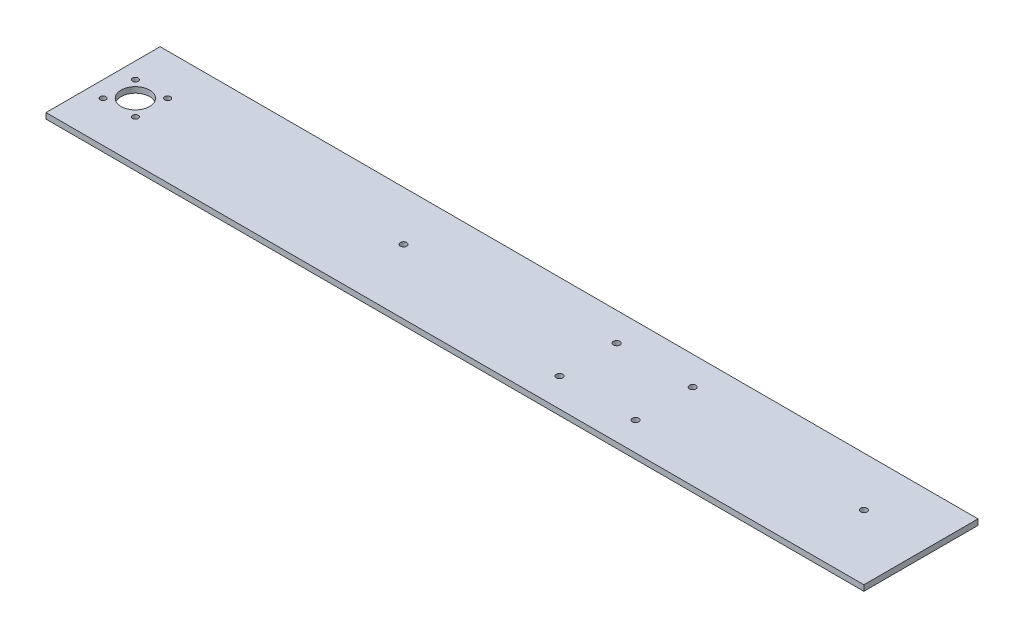
ISO-10303-21;
HEADER;
FILE_DESCRIPTION(('STEP AP214'),'2;1');
FILE_NAME('part.step','',(''),(''),'','','');
FILE_SCHEMA(('AUTOMOTIVE_DESIGN { 1 0 10303 214 1 1 1 1 }'));
ENDSEC;
DATA;
#1=APPLICATION_CONTEXT('core data for automotive mechanical design processes');
#2=APPLICATION_PROTOCOL_DEFINITION('international standard','automotive_design',2000,#1);
#3=PRODUCT_CONTEXT('',#1,'mechanical');
#4=PRODUCT('Part','Part','',(#3));
#5=PRODUCT_RELATED_PRODUCT_CATEGORY('part','',(#4));
#6=PRODUCT_DEFINITION_FORMATION('','',#4);
#7=PRODUCT_DEFINITION_CONTEXT('part definition',#1,'design');
#8=PRODUCT_DEFINITION('design','',#6,#7);
#9=PRODUCT_DEFINITION_SHAPE('','',#8);
#10=(LENGTH_UNIT() NAMED_UNIT(*) SI_UNIT(.MILLI.,.METRE.));
#11=(NAMED_UNIT(*) PLANE_ANGLE_UNIT() SI_UNIT($,.RADIAN.));
#12=(NAMED_UNIT(*) SI_UNIT($,.STERADIAN.) SOLID_ANGLE_UNIT());
#13=UNCERTAINTY_MEASURE_WITH_UNIT(LENGTH_MEASURE(1.E-05),#10,'distance_accuracy_value','');
#14=(GEOMETRIC_REPRESENTATION_CONTEXT(3) GLOBAL_UNCERTAINTY_ASSIGNED_CONTEXT((#13)) GLOBAL_UNIT_ASSIGNED_CONTEXT((#10,
#11,#12)) REPRESENTATION_CONTEXT('',''));
#15=CARTESIAN_POINT('',(0.,0.,0.));
#16=DIRECTION('',(0.,0.,1.));
#17=DIRECTION('',(1.,0.,0.));
#18=AXIS2_PLACEMENT_3D('',#15,#16,#17);
#19=CARTESIAN_POINT('',(-130.,3.,0.));
#20=DIRECTION('',(1.,0.,0.));
#21=DIRECTION('',(0.,0.,-1.));
#22=AXIS2_PLACEMENT_3D('',#19,#20,#21);
#23=PLANE('',#22);
#24=DIRECTION('',(0.,0.,1.));
#25=VECTOR('',#24,1.);
#26=CARTESIAN_POINT('',(-130.,0.,0.));
#27=LINE('',#26,#25);
#28=CARTESIAN_POINT('',(-130.,0.,-60.));
#29=VERTEX_POINT('',#28);
#30=CARTESIAN_POINT('',(-130.,0.,0.));
#31=VERTEX_POINT('',#30);
#32=EDGE_CURVE('E103',#29,#31,#27,.T.);
#33=ORIENTED_EDGE('',*,*,#32,.T.);
#34=DIRECTION('',(0.,-1.,0.));
#35=VECTOR('',#34,1.);
#36=CARTESIAN_POINT('',(-130.,3.,0.));
#37=LINE('',#36,#35);
#38=CARTESIAN_POINT('',(-130.,3.,0.));
#39=VERTEX_POINT('',#38);
#40=EDGE_CURVE('E11',#39,#31,#37,.T.);
#41=ORIENTED_EDGE('',*,*,#40,.F.);
#42=DIRECTION('',(0.,0.,1.));
#43=VECTOR('',#42,1.);
#44=CARTESIAN_POINT('',(-130.,3.,0.));
#45=LINE('',#44,#43);
#46=CARTESIAN_POINT('',(-130.,3.,-60.));
#47=VERTEX_POINT('',#46);
#48=EDGE_CURVE('E90',#47,#39,#45,.T.);
#49=ORIENTED_EDGE('',*,*,#48,.F.);
#50=DIRECTION('',(0.,-1.,0.));
#51=VECTOR('',#50,1.);
#52=CARTESIAN_POINT('',(-130.,3.,-60.));
#53=LINE('',#52,#51);
#54=EDGE_CURVE('E99',#47,#29,#53,.T.);
#55=ORIENTED_EDGE('',*,*,#54,.T.);
#56=EDGE_LOOP('',(#33,#41,#49,#55));
#57=FACE_BOUND('',#56,.T.);
#58=ADVANCED_FACE('F37',(#57),#23,.F.);
#59=CARTESIAN_POINT('',(-130.,3.,0.));
#60=DIRECTION('',(0.,0.,-1.));
#61=DIRECTION('',(-1.,0.,0.));
#62=AXIS2_PLACEMENT_3D('',#59,#60,#61);
#63=PLANE('',#62);
#64=DIRECTION('',(1.,0.,0.));
#65=VECTOR('',#64,1.);
#66=CARTESIAN_POINT('',(-130.,0.,0.));
#67=LINE('',#66,#65);
#68=CARTESIAN_POINT('',(300.,0.,0.));
#69=VERTEX_POINT('',#68);
#70=EDGE_CURVE('E94',#31,#69,#67,.T.);
#71=ORIENTED_EDGE('',*,*,#70,.T.);
#72=DIRECTION('',(0.,-1.,0.));
#73=VECTOR('',#72,1.);
#74=CARTESIAN_POINT('',(300.,3.,0.));
#75=LINE('',#74,#73);
#76=CARTESIAN_POINT('',(300.,3.,0.));
#77=VERTEX_POINT('',#76);
#78=EDGE_CURVE('E46',#77,#69,#75,.T.);
#79=ORIENTED_EDGE('',*,*,#78,.F.);
#80=DIRECTION('',(1.,0.,0.));
#81=VECTOR('',#80,1.);
#82=CARTESIAN_POINT('',(-130.,3.,0.));
#83=LINE('',#82,#81);
#84=EDGE_CURVE('E85',#39,#77,#83,.T.);
#85=ORIENTED_EDGE('',*,*,#84,.F.);
#86=ORIENTED_EDGE('',*,*,#40,.T.);
#87=EDGE_LOOP('',(#71,#79,#85,#86));
#88=FACE_BOUND('',#87,.T.);
#89=ADVANCED_FACE('F93',(#88),#63,.F.);
#90=CARTESIAN_POINT('',(300.,3.,0.));
#91=DIRECTION('',(-1.,0.,0.));
#92=DIRECTION('',(0.,0.,1.));
#93=AXIS2_PLACEMENT_3D('',#90,#91,#92);
#94=PLANE('',#93);
#95=DIRECTION('',(0.,0.,-1.));
#96=VECTOR('',#95,1.);
#97=CARTESIAN_POINT('',(300.,0.,0.));
#98=LINE('',#97,#96);
#99=CARTESIAN_POINT('',(300.,0.,-60.));
#100=VERTEX_POINT('',#99);
#101=EDGE_CURVE('E72',#69,#100,#98,.T.);
#102=ORIENTED_EDGE('',*,*,#101,.T.);
#103=DIRECTION('',(0.,-1.,0.));
#104=VECTOR('',#103,1.);
#105=CARTESIAN_POINT('',(300.,3.,-60.));
#106=LINE('',#105,#104);
#107=CARTESIAN_POINT('',(300.,3.,-60.));
#108=VERTEX_POINT('',#107);
#109=EDGE_CURVE('E95',#108,#100,#106,.T.);
#110=ORIENTED_EDGE('',*,*,#109,.F.);
#111=DIRECTION('',(0.,0.,-1.));
#112=VECTOR('',#111,1.);
#113=CARTESIAN_POINT('',(300.,3.,0.));
#114=LINE('',#113,#112);
#115=EDGE_CURVE('E88',#77,#108,#114,.T.);
#116=ORIENTED_EDGE('',*,*,#115,.F.);
#117=ORIENTED_EDGE('',*,*,#78,.T.);
#118=EDGE_LOOP('',(#102,#110,#116,#117));
#119=FACE_BOUND('',#118,.T.);
#120=ADVANCED_FACE('F97',(#119),#94,.F.);
#121=CARTESIAN_POINT('',(-130.,3.,-60.));
#122=DIRECTION('',(0.,0.,1.));
#123=DIRECTION('',(1.,0.,0.));
#124=AXIS2_PLACEMENT_3D('',#121,#122,#123);
#125=PLANE('',#124);
#126=DIRECTION('',(-1.,0.,0.));
#127=VECTOR('',#126,1.);
#128=CARTESIAN_POINT('',(-130.,0.,-60.));
#129=LINE('',#128,#127);
#130=EDGE_CURVE('E78',#100,#29,#129,.T.);
#131=ORIENTED_EDGE('',*,*,#130,.T.);
#132=ORIENTED_EDGE('',*,*,#54,.F.);
#133=DIRECTION('',(-1.,0.,0.));
#134=VECTOR('',#133,1.);
#135=CARTESIAN_POINT('',(-130.,3.,-60.));
#136=LINE('',#135,#134);
#137=EDGE_CURVE('E55',#108,#47,#136,.T.);
#138=ORIENTED_EDGE('',*,*,#137,.F.);
#139=ORIENTED_EDGE('',*,*,#109,.T.);
#140=EDGE_LOOP('',(#131,#132,#138,#139));
#141=FACE_BOUND('',#140,.T.);
#142=ADVANCED_FACE('F189',(#141),#125,.F.);
#143=CARTESIAN_POINT('',(0.,3.,0.));
#144=DIRECTION('',(0.,-1.,0.));
#145=DIRECTION('',(0.,0.,-1.));
#146=AXIS2_PLACEMENT_3D('',#143,#144,#145);
#147=PLANE('',#146);
#148=CARTESIAN_POINT('',(-104.514718625754,3.,-21.5147186257579));
#149=DIRECTION('',(0.,1.,0.));
#150=DIRECTION('',(0.,0.,1.));
#151=AXIS2_PLACEMENT_3D('',#148,#149,#150);
#152=CIRCLE('',#151,1.49999999999999);
#153=CARTESIAN_POINT('',(-104.514718625754,3.,-20.0147186257579));
#154=VERTEX_POINT('',#153);
#155=EDGE_CURVE('E133',#154,#154,#152,.T.);
#156=ORIENTED_EDGE('',*,*,#155,.F.);
#157=EDGE_LOOP('',(#156));
#158=FACE_BOUND('',#157,.T.);
#159=CARTESIAN_POINT('',(-104.514718625754,3.,-38.485281374235));
#160=DIRECTION('',(0.,1.,0.));
#161=DIRECTION('',(0.,0.,1.));
#162=AXIS2_PLACEMENT_3D('',#159,#160,#161);
#163=CIRCLE('',#162,1.49999999999999);
#164=CARTESIAN_POINT('',(-104.514718625754,3.,-36.985281374235));
#165=VERTEX_POINT('',#164);
#166=EDGE_CURVE('E123',#165,#165,#163,.T.);
#167=ORIENTED_EDGE('',*,*,#166,.F.);
#168=EDGE_LOOP('',(#167));
#169=FACE_BOUND('',#168,.T.);
#170=CARTESIAN_POINT('',(-121.485281374231,3.,-21.5147186257577));
#171=DIRECTION('',(0.,1.,0.));
#172=DIRECTION('',(0.,0.,1.));
#173=AXIS2_PLACEMENT_3D('',#170,#171,#172);
#174=CIRCLE('',#173,1.49999999999999);
#175=CARTESIAN_POINT('',(-121.485281374231,3.,-20.0147186257577));
#176=VERTEX_POINT('',#175);
#177=EDGE_CURVE('E120',#176,#176,#174,.T.);
#178=ORIENTED_EDGE('',*,*,#177,.F.);
#179=EDGE_LOOP('',(#178));
#180=FACE_BOUND('',#179,.T.);
#181=CARTESIAN_POINT('',(-121.485281374231,3.,-38.4852813742348));
#182=DIRECTION('',(0.,1.,0.));
#183=DIRECTION('',(0.,0.,1.));
#184=AXIS2_PLACEMENT_3D('',#181,#182,#183);
#185=CIRCLE('',#184,1.49999999999999);
#186=CARTESIAN_POINT('',(-121.485281374231,3.,-36.9852813742348));
#187=VERTEX_POINT('',#186);
#188=EDGE_CURVE('E119',#187,#187,#185,.T.);
#189=ORIENTED_EDGE('',*,*,#188,.F.);
#190=EDGE_LOOP('',(#189));
#191=FACE_BOUND('',#190,.T.);
#192=CARTESIAN_POINT('',(-113.,3.,-30.));
#193=DIRECTION('',(0.,1.,0.));
#194=DIRECTION('',(0.,0.,1.));
#195=AXIS2_PLACEMENT_3D('',#192,#193,#194);
#196=CIRCLE('',#195,7.50000000000001);
#197=CARTESIAN_POINT('',(-113.,3.,-22.5));
#198=VERTEX_POINT('',#197);
#199=EDGE_CURVE('E116',#198,#198,#196,.T.);
#200=ORIENTED_EDGE('',*,*,#199,.F.);
#201=EDGE_LOOP('',(#200));
#202=FACE_BOUND('',#201,.T.);
#203=CARTESIAN_POINT('',(266.,3.,-34.));
#204=DIRECTION('',(0.,1.,0.));
#205=DIRECTION('',(0.,0.,1.));
#206=AXIS2_PLACEMENT_3D('',#203,#204,#205);
#207=CIRCLE('',#206,1.69999999999998);
#208=CARTESIAN_POINT('',(266.,3.,-32.3));
#209=VERTEX_POINT('',#208);
#210=EDGE_CURVE('E115',#209,#209,#207,.T.);
#211=ORIENTED_EDGE('',*,*,#210,.F.);
#212=EDGE_LOOP('',(#211));
#213=FACE_BOUND('',#212,.T.);
#214=CARTESIAN_POINT('',(24.,3.,-34.));
#215=DIRECTION('',(0.,1.,0.));
#216=DIRECTION('',(0.,0.,1.));
#217=AXIS2_PLACEMENT_3D('',#214,#215,#216);
#218=CIRCLE('',#217,1.69999999999999);
#219=CARTESIAN_POINT('',(24.,3.,-32.3));
#220=VERTEX_POINT('',#219);
#221=EDGE_CURVE('E148',#220,#220,#218,.T.);
#222=ORIENTED_EDGE('',*,*,#221,.F.);
#223=EDGE_LOOP('',(#222));
#224=FACE_BOUND('',#223,.T.);
#225=CARTESIAN_POINT('',(125.,3.,-15.));
#226=DIRECTION('',(0.,1.,0.));
#227=DIRECTION('',(0.,0.,1.));
#228=AXIS2_PLACEMENT_3D('',#225,#226,#227);
#229=CIRCLE('',#228,1.69999999999998);
#230=CARTESIAN_POINT('',(125.,3.,-13.3));
#231=VERTEX_POINT('',#230);
#232=EDGE_CURVE('E154',#231,#231,#229,.T.);
#233=ORIENTED_EDGE('',*,*,#232,.F.);
#234=EDGE_LOOP('',(#233));
#235=FACE_BOUND('',#234,.T.);
#236=CARTESIAN_POINT('',(165.,3.,-15.));
#237=DIRECTION('',(0.,1.,0.));
#238=DIRECTION('',(0.,0.,1.));
#239=AXIS2_PLACEMENT_3D('',#236,#237,#238);
#240=CIRCLE('',#239,1.69999999999998);
#241=CARTESIAN_POINT('',(165.,3.,-13.3));
#242=VERTEX_POINT('',#241);
#243=EDGE_CURVE('E160',#242,#242,#240,.T.);
#244=ORIENTED_EDGE('',*,*,#243,.F.);
#245=EDGE_LOOP('',(#244));
#246=FACE_BOUND('',#245,.T.);
#247=CARTESIAN_POINT('',(165.,3.,-45.));
#248=DIRECTION('',(0.,1.,0.));
#249=DIRECTION('',(0.,0.,1.));
#250=AXIS2_PLACEMENT_3D('',#247,#248,#249);
#251=CIRCLE('',#250,1.69999999999998);
#252=CARTESIAN_POINT('',(165.,3.,-43.3));
#253=VERTEX_POINT('',#252);
#254=EDGE_CURVE('E166',#253,#253,#251,.T.);
#255=ORIENTED_EDGE('',*,*,#254,.F.);
#256=EDGE_LOOP('',(#255));
#257=FACE_BOUND('',#256,.T.);
#258=CARTESIAN_POINT('',(125.,3.,-45.));
#259=DIRECTION('',(0.,1.,0.));
#260=DIRECTION('',(0.,0.,1.));
#261=AXIS2_PLACEMENT_3D('',#258,#259,#260);
#262=CIRCLE('',#261,1.69999999999998);
#263=CARTESIAN_POINT('',(125.,3.,-43.3));
#264=VERTEX_POINT('',#263);
#265=EDGE_CURVE('E172',#264,#264,#262,.T.);
#266=ORIENTED_EDGE('',*,*,#265,.F.);
#267=EDGE_LOOP('',(#266));
#268=FACE_BOUND('',#267,.T.);
#269=ORIENTED_EDGE('',*,*,#48,.T.);
#270=ORIENTED_EDGE('',*,*,#84,.T.);
#271=ORIENTED_EDGE('',*,*,#115,.T.);
#272=ORIENTED_EDGE('',*,*,#137,.T.);
#273=EDGE_LOOP('',(#269,#270,#271,#272));
#274=FACE_BOUND('',#273,.T.);
#275=ADVANCED_FACE('F86',(#158,#169,#180,#191,#202,#213,#224,#235,#246,#257,#268,#274),#147,.F.);
#276=CARTESIAN_POINT('',(0.,0.,0.));
#277=DIRECTION('',(0.,-1.,0.));
#278=DIRECTION('',(0.,0.,-1.));
#279=AXIS2_PLACEMENT_3D('',#276,#277,#278);
#280=PLANE('',#279);
#281=CARTESIAN_POINT('',(-104.514718625754,0.,-21.5147186257579));
#282=DIRECTION('',(0.,-1.,0.));
#283=DIRECTION('',(0.,0.,-1.));
#284=AXIS2_PLACEMENT_3D('',#281,#282,#283);
#285=CIRCLE('',#284,1.49999999999999);
#286=CARTESIAN_POINT('',(-104.514718625754,0.,-23.0147186257579));
#287=VERTEX_POINT('',#286);
#288=EDGE_CURVE('E40',#287,#287,#285,.T.);
#289=ORIENTED_EDGE('',*,*,#288,.F.);
#290=EDGE_LOOP('',(#289));
#291=FACE_BOUND('',#290,.T.);
#292=CARTESIAN_POINT('',(-104.514718625754,0.,-38.485281374235));
#293=DIRECTION('',(0.,-1.,0.));
#294=DIRECTION('',(0.,0.,-1.));
#295=AXIS2_PLACEMENT_3D('',#292,#293,#294);
#296=CIRCLE('',#295,1.49999999999999);
#297=CARTESIAN_POINT('',(-104.514718625754,0.,-39.985281374235));
#298=VERTEX_POINT('',#297);
#299=EDGE_CURVE('E121',#298,#298,#296,.T.);
#300=ORIENTED_EDGE('',*,*,#299,.F.);
#301=EDGE_LOOP('',(#300));
#302=FACE_BOUND('',#301,.T.);
#303=CARTESIAN_POINT('',(-121.485281374231,0.,-21.5147186257577));
#304=DIRECTION('',(0.,-1.,0.));
#305=DIRECTION('',(0.,0.,-1.));
#306=AXIS2_PLACEMENT_3D('',#303,#304,#305);
#307=CIRCLE('',#306,1.49999999999999);
#308=CARTESIAN_POINT('',(-121.485281374231,0.,-23.0147186257577));
#309=VERTEX_POINT('',#308);
#310=EDGE_CURVE('E117',#309,#309,#307,.T.);
#311=ORIENTED_EDGE('',*,*,#310,.F.);
#312=EDGE_LOOP('',(#311));
#313=FACE_BOUND('',#312,.T.);
#314=CARTESIAN_POINT('',(-121.485281374231,0.,-38.4852813742348));
#315=DIRECTION('',(0.,-1.,0.));
#316=DIRECTION('',(0.,0.,-1.));
#317=AXIS2_PLACEMENT_3D('',#314,#315,#316);
#318=CIRCLE('',#317,1.49999999999999);
#319=CARTESIAN_POINT('',(-121.485281374231,0.,-39.9852813742348));
#320=VERTEX_POINT('',#319);
#321=EDGE_CURVE('E138',#320,#320,#318,.T.);
#322=ORIENTED_EDGE('',*,*,#321,.F.);
#323=EDGE_LOOP('',(#322));
#324=FACE_BOUND('',#323,.T.);
#325=CARTESIAN_POINT('',(-113.,0.,-30.));
#326=DIRECTION('',(0.,-1.,0.));
#327=DIRECTION('',(0.,0.,-1.));
#328=AXIS2_PLACEMENT_3D('',#325,#326,#327);
#329=CIRCLE('',#328,7.50000000000001);
#330=CARTESIAN_POINT('',(-113.,0.,-37.5));
#331=VERTEX_POINT('',#330);
#332=EDGE_CURVE('E112',#331,#331,#329,.T.);
#333=ORIENTED_EDGE('',*,*,#332,.F.);
#334=EDGE_LOOP('',(#333));
#335=FACE_BOUND('',#334,.T.);
#336=CARTESIAN_POINT('',(266.,0.,-34.));
#337=DIRECTION('',(0.,1.,0.));
#338=DIRECTION('',(0.,0.,1.));
#339=AXIS2_PLACEMENT_3D('',#336,#337,#338);
#340=CIRCLE('',#339,1.69999999999998);
#341=CARTESIAN_POINT('',(266.,0.,-32.3));
#342=VERTEX_POINT('',#341);
#343=EDGE_CURVE('E145',#342,#342,#340,.T.);
#344=ORIENTED_EDGE('',*,*,#343,.T.);
#345=EDGE_LOOP('',(#344));
#346=FACE_BOUND('',#345,.T.);
#347=CARTESIAN_POINT('',(24.,0.,-34.));
#348=DIRECTION('',(0.,1.,0.));
#349=DIRECTION('',(0.,0.,1.));
#350=AXIS2_PLACEMENT_3D('',#347,#348,#349);
#351=CIRCLE('',#350,1.7);
#352=CARTESIAN_POINT('',(24.,0.,-32.3));
#353=VERTEX_POINT('',#352);
#354=EDGE_CURVE('E151',#353,#353,#351,.T.);
#355=ORIENTED_EDGE('',*,*,#354,.T.);
#356=EDGE_LOOP('',(#355));
#357=FACE_BOUND('',#356,.T.);
#358=CARTESIAN_POINT('',(125.,0.,-15.));
#359=DIRECTION('',(0.,1.,0.));
#360=DIRECTION('',(0.,0.,1.));
#361=AXIS2_PLACEMENT_3D('',#358,#359,#360);
#362=CIRCLE('',#361,1.70000000000001);
#363=CARTESIAN_POINT('',(125.,0.,-13.3));
#364=VERTEX_POINT('',#363);
#365=EDGE_CURVE('E157',#364,#364,#362,.T.);
#366=ORIENTED_EDGE('',*,*,#365,.T.);
#367=EDGE_LOOP('',(#366));
#368=FACE_BOUND('',#367,.T.);
#369=CARTESIAN_POINT('',(165.,0.,-15.));
#370=DIRECTION('',(0.,1.,0.));
#371=DIRECTION('',(0.,0.,1.));
#372=AXIS2_PLACEMENT_3D('',#369,#370,#371);
#373=CIRCLE('',#372,1.70000000000001);
#374=CARTESIAN_POINT('',(165.,0.,-13.3));
#375=VERTEX_POINT('',#374);
#376=EDGE_CURVE('E163',#375,#375,#373,.T.);
#377=ORIENTED_EDGE('',*,*,#376,.T.);
#378=EDGE_LOOP('',(#377));
#379=FACE_BOUND('',#378,.T.);
#380=CARTESIAN_POINT('',(165.,0.,-45.));
#381=DIRECTION('',(0.,1.,0.));
#382=DIRECTION('',(0.,0.,1.));
#383=AXIS2_PLACEMENT_3D('',#380,#381,#382);
#384=CIRCLE('',#383,1.70000000000001);
#385=CARTESIAN_POINT('',(165.,0.,-43.3));
#386=VERTEX_POINT('',#385);
#387=EDGE_CURVE('E169',#386,#386,#384,.T.);
#388=ORIENTED_EDGE('',*,*,#387,.T.);
#389=EDGE_LOOP('',(#388));
#390=FACE_BOUND('',#389,.T.);
#391=CARTESIAN_POINT('',(125.,0.,-45.));
#392=DIRECTION('',(0.,1.,0.));
#393=DIRECTION('',(0.,0.,1.));
#394=AXIS2_PLACEMENT_3D('',#391,#392,#393);
#395=CIRCLE('',#394,1.70000000000001);
#396=CARTESIAN_POINT('',(125.,0.,-43.3));
#397=VERTEX_POINT('',#396);
#398=EDGE_CURVE('E106',#397,#397,#395,.T.);
#399=ORIENTED_EDGE('',*,*,#398,.T.);
#400=EDGE_LOOP('',(#399));
#401=FACE_BOUND('',#400,.T.);
#402=ORIENTED_EDGE('',*,*,#32,.F.);
#403=ORIENTED_EDGE('',*,*,#130,.F.);
#404=ORIENTED_EDGE('',*,*,#101,.F.);
#405=ORIENTED_EDGE('',*,*,#70,.F.);
#406=EDGE_LOOP('',(#402,#403,#404,#405));
#407=FACE_BOUND('',#406,.T.);
#408=ADVANCED_FACE('F178',(#291,#302,#313,#324,#335,#346,#357,#368,#379,#390,#401,#407),#280,.T.);
#409=CARTESIAN_POINT('',(125.,3.,-45.));
#410=DIRECTION('',(0.,1.,0.));
#411=DIRECTION('',(0.,0.,1.));
#412=AXIS2_PLACEMENT_3D('',#409,#410,#411);
#413=CYLINDRICAL_SURFACE('',#412,1.69999999999999);
#414=ORIENTED_EDGE('',*,*,#398,.F.);
#415=EDGE_LOOP('',(#414));
#416=FACE_BOUND('',#415,.T.);
#417=ORIENTED_EDGE('',*,*,#265,.T.);
#418=EDGE_LOOP('',(#417));
#419=FACE_BOUND('',#418,.T.);
#420=ADVANCED_FACE('F181',(#416,#419),#413,.F.);
#421=CARTESIAN_POINT('',(165.,3.,-45.));
#422=DIRECTION('',(0.,1.,0.));
#423=DIRECTION('',(0.,0.,1.));
#424=AXIS2_PLACEMENT_3D('',#421,#422,#423);
#425=CYLINDRICAL_SURFACE('',#424,1.69999999999999);
#426=ORIENTED_EDGE('',*,*,#387,.F.);
#427=EDGE_LOOP('',(#426));
#428=FACE_BOUND('',#427,.T.);
#429=ORIENTED_EDGE('',*,*,#254,.T.);
#430=EDGE_LOOP('',(#429));
#431=FACE_BOUND('',#430,.T.);
#432=ADVANCED_FACE('F184',(#428,#431),#425,.F.);
#433=CARTESIAN_POINT('',(165.,3.,-15.));
#434=DIRECTION('',(0.,1.,0.));
#435=DIRECTION('',(0.,0.,1.));
#436=AXIS2_PLACEMENT_3D('',#433,#434,#435);
#437=CYLINDRICAL_SURFACE('',#436,1.69999999999999);
#438=ORIENTED_EDGE('',*,*,#376,.F.);
#439=EDGE_LOOP('',(#438));
#440=FACE_BOUND('',#439,.T.);
#441=ORIENTED_EDGE('',*,*,#243,.T.);
#442=EDGE_LOOP('',(#441));
#443=FACE_BOUND('',#442,.T.);
#444=ADVANCED_FACE('F234',(#440,#443),#437,.F.);
#445=CARTESIAN_POINT('',(125.,3.,-15.));
#446=DIRECTION('',(0.,1.,0.));
#447=DIRECTION('',(0.,0.,1.));
#448=AXIS2_PLACEMENT_3D('',#445,#446,#447);
#449=CYLINDRICAL_SURFACE('',#448,1.69999999999999);
#450=ORIENTED_EDGE('',*,*,#365,.F.);
#451=EDGE_LOOP('',(#450));
#452=FACE_BOUND('',#451,.T.);
#453=ORIENTED_EDGE('',*,*,#232,.T.);
#454=EDGE_LOOP('',(#453));
#455=FACE_BOUND('',#454,.T.);
#456=ADVANCED_FACE('F244',(#452,#455),#449,.F.);
#457=CARTESIAN_POINT('',(24.,3.,-34.));
#458=DIRECTION('',(0.,1.,0.));
#459=DIRECTION('',(0.,0.,1.));
#460=AXIS2_PLACEMENT_3D('',#457,#458,#459);
#461=CYLINDRICAL_SURFACE('',#460,1.69999999999999);
#462=ORIENTED_EDGE('',*,*,#354,.F.);
#463=EDGE_LOOP('',(#462));
#464=FACE_BOUND('',#463,.T.);
#465=ORIENTED_EDGE('',*,*,#221,.T.);
#466=EDGE_LOOP('',(#465));
#467=FACE_BOUND('',#466,.T.);
#468=ADVANCED_FACE('F254',(#464,#467),#461,.F.);
#469=CARTESIAN_POINT('',(266.,3.,-34.));
#470=DIRECTION('',(0.,1.,0.));
#471=DIRECTION('',(0.,0.,1.));
#472=AXIS2_PLACEMENT_3D('',#469,#470,#471);
#473=CYLINDRICAL_SURFACE('',#472,1.69999999999998);
#474=ORIENTED_EDGE('',*,*,#343,.F.);
#475=EDGE_LOOP('',(#474));
#476=FACE_BOUND('',#475,.T.);
#477=ORIENTED_EDGE('',*,*,#210,.T.);
#478=EDGE_LOOP('',(#477));
#479=FACE_BOUND('',#478,.T.);
#480=ADVANCED_FACE('F264',(#476,#479),#473,.F.);
#481=CARTESIAN_POINT('',(-113.,-2.,-30.));
#482=DIRECTION('',(0.,1.,0.));
#483=DIRECTION('',(0.,0.,1.));
#484=AXIS2_PLACEMENT_3D('',#481,#482,#483);
#485=CYLINDRICAL_SURFACE('',#484,7.50000000000001);
#486=ORIENTED_EDGE('',*,*,#332,.T.);
#487=EDGE_LOOP('',(#486));
#488=FACE_BOUND('',#487,.T.);
#489=ORIENTED_EDGE('',*,*,#199,.T.);
#490=EDGE_LOOP('',(#489));
#491=FACE_BOUND('',#490,.T.);
#492=ADVANCED_FACE('F274',(#488,#491),#485,.F.);
#493=CARTESIAN_POINT('',(-121.485281374231,3.,-38.4852813742348));
#494=DIRECTION('',(0.,1.,0.));
#495=DIRECTION('',(0.,0.,1.));
#496=AXIS2_PLACEMENT_3D('',#493,#494,#495);
#497=CYLINDRICAL_SURFACE('',#496,1.49999999999999);
#498=ORIENTED_EDGE('',*,*,#321,.T.);
#499=EDGE_LOOP('',(#498));
#500=FACE_BOUND('',#499,.T.);
#501=ORIENTED_EDGE('',*,*,#188,.T.);
#502=EDGE_LOOP('',(#501));
#503=FACE_BOUND('',#502,.T.);
#504=ADVANCED_FACE('F283',(#500,#503),#497,.F.);
#505=CARTESIAN_POINT('',(-121.485281374231,3.,-21.5147186257577));
#506=DIRECTION('',(0.,1.,0.));
#507=DIRECTION('',(0.,0.,1.));
#508=AXIS2_PLACEMENT_3D('',#505,#506,#507);
#509=CYLINDRICAL_SURFACE('',#508,1.49999999999999);
#510=ORIENTED_EDGE('',*,*,#310,.T.);
#511=EDGE_LOOP('',(#510));
#512=FACE_BOUND('',#511,.T.);
#513=ORIENTED_EDGE('',*,*,#177,.T.);
#514=EDGE_LOOP('',(#513));
#515=FACE_BOUND('',#514,.T.);
#516=ADVANCED_FACE('F302',(#512,#515),#509,.F.);
#517=CARTESIAN_POINT('',(-104.514718625754,3.,-38.485281374235));
#518=DIRECTION('',(0.,1.,0.));
#519=DIRECTION('',(0.,0.,1.));
#520=AXIS2_PLACEMENT_3D('',#517,#518,#519);
#521=CYLINDRICAL_SURFACE('',#520,1.49999999999999);
#522=ORIENTED_EDGE('',*,*,#299,.T.);
#523=EDGE_LOOP('',(#522));
#524=FACE_BOUND('',#523,.T.);
#525=ORIENTED_EDGE('',*,*,#166,.T.);
#526=EDGE_LOOP('',(#525));
#527=FACE_BOUND('',#526,.T.);
#528=ADVANCED_FACE('F312',(#524,#527),#521,.F.);
#529=CARTESIAN_POINT('',(-104.514718625754,3.,-21.5147186257579));
#530=DIRECTION('',(0.,1.,0.));
#531=DIRECTION('',(0.,0.,1.));
#532=AXIS2_PLACEMENT_3D('',#529,#530,#531);
#533=CYLINDRICAL_SURFACE('',#532,1.49999999999999);
#534=ORIENTED_EDGE('',*,*,#288,.T.);
#535=EDGE_LOOP('',(#534));
#536=FACE_BOUND('',#535,.T.);
#537=ORIENTED_EDGE('',*,*,#155,.T.);
#538=EDGE_LOOP('',(#537));
#539=FACE_BOUND('',#538,.T.);
#540=ADVANCED_FACE('F322',(#536,#539),#533,.F.);
#541=CLOSED_SHELL('',(#58,#89,#120,#142,#275,#408,#420,#432,#444,#456,#468,#480,#492,#504,#516,
#528,#540));
#542=MANIFOLD_SOLID_BREP('B2',#541);
#543=ADVANCED_BREP_SHAPE_REPRESENTATION('',(#18,#542),#14);
#544=SHAPE_DEFINITION_REPRESENTATION(#9,#543);
ENDSEC;
END-ISO-10303-21;
